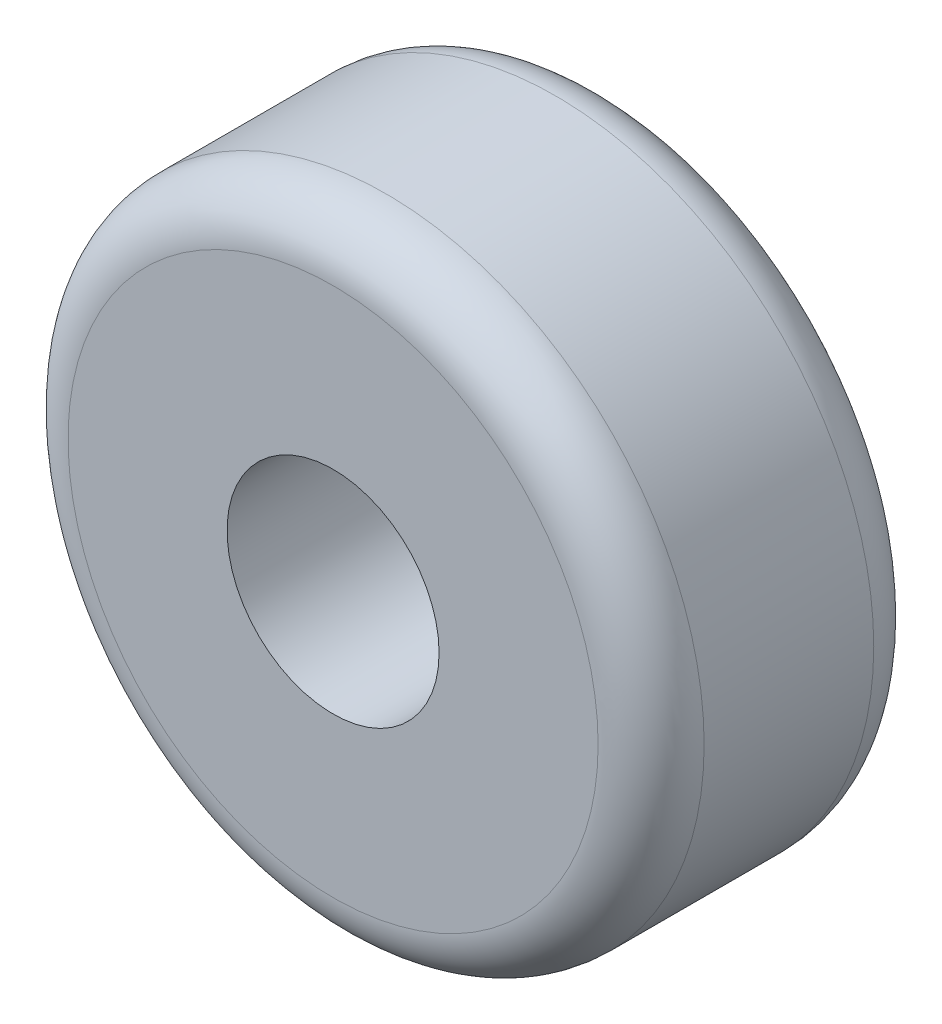
ISO-10303-21;
HEADER;
FILE_DESCRIPTION(('STEP AP214'),'2;1');
FILE_NAME('part.step','',(''),(''),'','','');
FILE_SCHEMA(('AUTOMOTIVE_DESIGN { 1 0 10303 214 1 1 1 1 }'));
ENDSEC;
DATA;
#1=APPLICATION_CONTEXT('core data for automotive mechanical design processes');
#2=APPLICATION_PROTOCOL_DEFINITION('international standard','automotive_design',2000,#1);
#3=PRODUCT_CONTEXT('',#1,'mechanical');
#4=PRODUCT('Part','Part','',(#3));
#5=PRODUCT_RELATED_PRODUCT_CATEGORY('part','',(#4));
#6=PRODUCT_DEFINITION_FORMATION('','',#4);
#7=PRODUCT_DEFINITION_CONTEXT('part definition',#1,'design');
#8=PRODUCT_DEFINITION('design','',#6,#7);
#9=PRODUCT_DEFINITION_SHAPE('','',#8);
#10=(LENGTH_UNIT() NAMED_UNIT(*) SI_UNIT(.MILLI.,.METRE.));
#11=(NAMED_UNIT(*) PLANE_ANGLE_UNIT() SI_UNIT($,.RADIAN.));
#12=(NAMED_UNIT(*) SI_UNIT($,.STERADIAN.) SOLID_ANGLE_UNIT());
#13=UNCERTAINTY_MEASURE_WITH_UNIT(LENGTH_MEASURE(1.E-05),#10,'distance_accuracy_value','');
#14=(GEOMETRIC_REPRESENTATION_CONTEXT(3) GLOBAL_UNCERTAINTY_ASSIGNED_CONTEXT((#13)) GLOBAL_UNIT_ASSIGNED_CONTEXT((#10,
#11,#12)) REPRESENTATION_CONTEXT('',''));
#15=CARTESIAN_POINT('',(0.,0.,0.));
#16=DIRECTION('',(0.,0.,1.));
#17=DIRECTION('',(1.,0.,0.));
#18=AXIS2_PLACEMENT_3D('',#15,#16,#17);
#19=CARTESIAN_POINT('',(0.,0.,10.4));
#20=DIRECTION('',(0.,0.,-1.));
#21=DIRECTION('',(-1.,0.,0.));
#22=AXIS2_PLACEMENT_3D('',#19,#20,#21);
#23=CYLINDRICAL_SURFACE('',#22,12.);
#24=CARTESIAN_POINT('',(0.,0.,2.));
#25=DIRECTION('',(0.,0.,1.));
#26=DIRECTION('',(1.,0.,0.));
#27=AXIS2_PLACEMENT_3D('',#24,#25,#26);
#28=CIRCLE('',#27,12.);
#29=CARTESIAN_POINT('',(12.,0.,2.));
#30=VERTEX_POINT('',#29);
#31=EDGE_CURVE('E59',#30,#30,#28,.T.);
#32=ORIENTED_EDGE('',*,*,#31,.T.);
#33=EDGE_LOOP('',(#32));
#34=FACE_BOUND('',#33,.T.);
#35=CARTESIAN_POINT('',(0.,0.,8.4));
#36=DIRECTION('',(0.,0.,1.));
#37=DIRECTION('',(1.,0.,0.));
#38=AXIS2_PLACEMENT_3D('',#35,#36,#37);
#39=CIRCLE('',#38,12.);
#40=CARTESIAN_POINT('',(12.,0.,8.4));
#41=VERTEX_POINT('',#40);
#42=EDGE_CURVE('E64',#41,#41,#39,.F.);
#43=ORIENTED_EDGE('',*,*,#42,.T.);
#44=EDGE_LOOP('',(#43));
#45=FACE_BOUND('',#44,.T.);
#46=ADVANCED_FACE('F51',(#34,#45),#23,.T.);
#47=CARTESIAN_POINT('',(0.,0.,10.4));
#48=DIRECTION('',(0.,0.,1.));
#49=DIRECTION('',(1.,0.,0.));
#50=AXIS2_PLACEMENT_3D('',#47,#48,#49);
#51=PLANE('',#50);
#52=CARTESIAN_POINT('',(0.,0.,10.4));
#53=DIRECTION('',(0.,0.,1.));
#54=DIRECTION('',(1.,0.,0.));
#55=AXIS2_PLACEMENT_3D('',#52,#53,#54);
#56=CIRCLE('',#55,4.);
#57=CARTESIAN_POINT('',(4.,0.,10.4));
#58=VERTEX_POINT('',#57);
#59=EDGE_CURVE('E75',#58,#58,#56,.T.);
#60=ORIENTED_EDGE('',*,*,#59,.F.);
#61=EDGE_LOOP('',(#60));
#62=FACE_BOUND('',#61,.T.);
#63=CARTESIAN_POINT('',(0.,0.,10.4));
#64=DIRECTION('',(0.,0.,1.));
#65=DIRECTION('',(1.,0.,0.));
#66=AXIS2_PLACEMENT_3D('',#63,#64,#65);
#67=CIRCLE('',#66,10.);
#68=CARTESIAN_POINT('',(10.,0.,10.4));
#69=VERTEX_POINT('',#68);
#70=EDGE_CURVE('E69',#69,#69,#67,.T.);
#71=ORIENTED_EDGE('',*,*,#70,.T.);
#72=EDGE_LOOP('',(#71));
#73=FACE_BOUND('',#72,.T.);
#74=ADVANCED_FACE('F87',(#62,#73),#51,.T.);
#75=CARTESIAN_POINT('',(0.,0.,0.));
#76=DIRECTION('',(0.,0.,1.));
#77=DIRECTION('',(1.,0.,0.));
#78=AXIS2_PLACEMENT_3D('',#75,#76,#77);
#79=PLANE('',#78);
#80=CARTESIAN_POINT('',(0.,0.,0.));
#81=DIRECTION('',(0.,0.,1.));
#82=DIRECTION('',(1.,0.,0.));
#83=AXIS2_PLACEMENT_3D('',#80,#81,#82);
#84=CIRCLE('',#83,4.);
#85=CARTESIAN_POINT('',(4.,0.,0.));
#86=VERTEX_POINT('',#85);
#87=EDGE_CURVE('E76',#86,#86,#84,.T.);
#88=ORIENTED_EDGE('',*,*,#87,.T.);
#89=EDGE_LOOP('',(#88));
#90=FACE_BOUND('',#89,.T.);
#91=CARTESIAN_POINT('',(0.,0.,0.));
#92=DIRECTION('',(0.,0.,1.));
#93=DIRECTION('',(1.,0.,0.));
#94=AXIS2_PLACEMENT_3D('',#91,#92,#93);
#95=CIRCLE('',#94,10.);
#96=CARTESIAN_POINT('',(10.,0.,0.));
#97=VERTEX_POINT('',#96);
#98=EDGE_CURVE('E10',#97,#97,#95,.F.);
#99=ORIENTED_EDGE('',*,*,#98,.T.);
#100=EDGE_LOOP('',(#99));
#101=FACE_BOUND('',#100,.T.);
#102=ADVANCED_FACE('F90',(#90,#101),#79,.F.);
#103=CARTESIAN_POINT('',(0.,0.,8.4));
#104=DIRECTION('',(0.,0.,1.));
#105=DIRECTION('',(1.,0.,0.));
#106=AXIS2_PLACEMENT_3D('',#103,#104,#105);
#107=TOROIDAL_SURFACE('',#106,10.,2.);
#108=ORIENTED_EDGE('',*,*,#42,.F.);
#109=EDGE_LOOP('',(#108));
#110=FACE_BOUND('',#109,.T.);
#111=ORIENTED_EDGE('',*,*,#70,.F.);
#112=EDGE_LOOP('',(#111));
#113=FACE_BOUND('',#112,.T.);
#114=ADVANCED_FACE('F94',(#110,#113),#107,.T.);
#115=CARTESIAN_POINT('',(0.,0.,2.));
#116=DIRECTION('',(0.,0.,1.));
#117=DIRECTION('',(1.,0.,0.));
#118=AXIS2_PLACEMENT_3D('',#115,#116,#117);
#119=TOROIDAL_SURFACE('',#118,10.,2.);
#120=ORIENTED_EDGE('',*,*,#98,.F.);
#121=EDGE_LOOP('',(#120));
#122=FACE_BOUND('',#121,.T.);
#123=ORIENTED_EDGE('',*,*,#31,.F.);
#124=EDGE_LOOP('',(#123));
#125=FACE_BOUND('',#124,.T.);
#126=ADVANCED_FACE('F53',(#122,#125),#119,.T.);
#127=CARTESIAN_POINT('',(0.,0.,10.4));
#128=DIRECTION('',(0.,0.,-1.));
#129=DIRECTION('',(-1.,0.,0.));
#130=AXIS2_PLACEMENT_3D('',#127,#128,#129);
#131=CYLINDRICAL_SURFACE('',#130,4.);
#132=ORIENTED_EDGE('',*,*,#59,.T.);
#133=EDGE_LOOP('',(#132));
#134=FACE_BOUND('',#133,.T.);
#135=ORIENTED_EDGE('',*,*,#87,.F.);
#136=EDGE_LOOP('',(#135));
#137=FACE_BOUND('',#136,.T.);
#138=ADVANCED_FACE('F84',(#134,#137),#131,.F.);
#139=CLOSED_SHELL('',(#46,#74,#102,#114,#126,#138));
#140=MANIFOLD_SOLID_BREP('B2',#139);
#141=ADVANCED_BREP_SHAPE_REPRESENTATION('',(#18,#140),#14);
#142=SHAPE_DEFINITION_REPRESENTATION(#9,#141);
ENDSEC;
END-ISO-10303-21;
